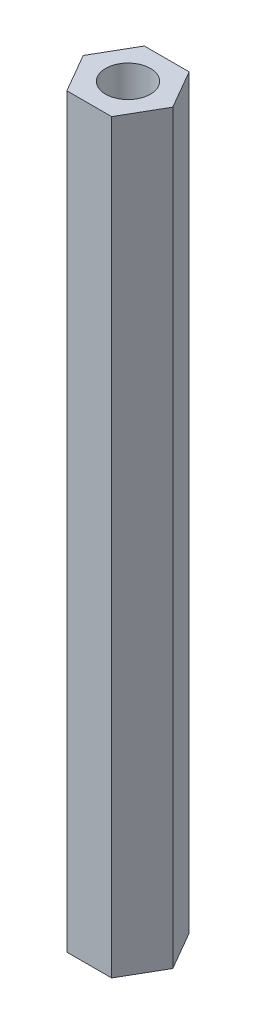
ISO-10303-21;
HEADER;
FILE_DESCRIPTION(('STEP AP214'),'2;1');
FILE_NAME('part.step','',(''),(''),'','','');
FILE_SCHEMA(('AUTOMOTIVE_DESIGN { 1 0 10303 214 1 1 1 1 }'));
ENDSEC;
DATA;
#1=APPLICATION_CONTEXT('core data for automotive mechanical design processes');
#2=APPLICATION_PROTOCOL_DEFINITION('international standard','automotive_design',2000,#1);
#3=PRODUCT_CONTEXT('',#1,'mechanical');
#4=PRODUCT('Part','Part','',(#3));
#5=PRODUCT_RELATED_PRODUCT_CATEGORY('part','',(#4));
#6=PRODUCT_DEFINITION_FORMATION('','',#4);
#7=PRODUCT_DEFINITION_CONTEXT('part definition',#1,'design');
#8=PRODUCT_DEFINITION('design','',#6,#7);
#9=PRODUCT_DEFINITION_SHAPE('','',#8);
#10=(LENGTH_UNIT() NAMED_UNIT(*) SI_UNIT(.MILLI.,.METRE.));
#11=(NAMED_UNIT(*) PLANE_ANGLE_UNIT() SI_UNIT($,.RADIAN.));
#12=(NAMED_UNIT(*) SI_UNIT($,.STERADIAN.) SOLID_ANGLE_UNIT());
#13=UNCERTAINTY_MEASURE_WITH_UNIT(LENGTH_MEASURE(1.E-05),#10,'distance_accuracy_value','');
#14=(GEOMETRIC_REPRESENTATION_CONTEXT(3) GLOBAL_UNCERTAINTY_ASSIGNED_CONTEXT((#13)) GLOBAL_UNIT_ASSIGNED_CONTEXT((#10,
#11,#12)) REPRESENTATION_CONTEXT('',''));
#15=CARTESIAN_POINT('',(0.,0.,0.));
#16=DIRECTION('',(0.,0.,1.));
#17=DIRECTION('',(1.,0.,0.));
#18=AXIS2_PLACEMENT_3D('',#15,#16,#17);
#19=CARTESIAN_POINT('',(0.,50.,0.));
#20=DIRECTION('',(0.,1.,0.));
#21=DIRECTION('',(0.,0.,1.));
#22=AXIS2_PLACEMENT_3D('',#19,#20,#21);
#23=PLANE('',#22);
#24=DIRECTION('',(0.5,0.,-0.866025403784439));
#25=VECTOR('',#24,1.);
#26=CARTESIAN_POINT('',(1.5,50.,2.59807621135332));
#27=LINE('',#26,#25);
#28=CARTESIAN_POINT('',(1.5,50.,2.59807621135332));
#29=VERTEX_POINT('',#28);
#30=CARTESIAN_POINT('',(3.,50.,0.));
#31=VERTEX_POINT('',#30);
#32=EDGE_CURVE('E133',#29,#31,#27,.T.);
#33=ORIENTED_EDGE('',*,*,#32,.T.);
#34=DIRECTION('',(-0.5,0.,-0.866025403784438));
#35=VECTOR('',#34,1.);
#36=CARTESIAN_POINT('',(3.,50.,0.));
#37=LINE('',#36,#35);
#38=CARTESIAN_POINT('',(1.5,50.,-2.59807621135332));
#39=VERTEX_POINT('',#38);
#40=EDGE_CURVE('E91',#31,#39,#37,.T.);
#41=ORIENTED_EDGE('',*,*,#40,.T.);
#42=DIRECTION('',(-1.,0.,0.));
#43=VECTOR('',#42,1.);
#44=CARTESIAN_POINT('',(1.5,50.,-2.59807621135332));
#45=LINE('',#44,#43);
#46=CARTESIAN_POINT('',(-1.5,50.,-2.59807621135332));
#47=VERTEX_POINT('',#46);
#48=EDGE_CURVE('E104',#39,#47,#45,.T.);
#49=ORIENTED_EDGE('',*,*,#48,.T.);
#50=DIRECTION('',(-0.5,0.,0.866025403784439));
#51=VECTOR('',#50,1.);
#52=CARTESIAN_POINT('',(-1.5,50.,-2.59807621135332));
#53=LINE('',#52,#51);
#54=CARTESIAN_POINT('',(-3.,50.,0.));
#55=VERTEX_POINT('',#54);
#56=EDGE_CURVE('E98',#47,#55,#53,.T.);
#57=ORIENTED_EDGE('',*,*,#56,.T.);
#58=DIRECTION('',(0.5,0.,0.866025403784439));
#59=VECTOR('',#58,1.);
#60=CARTESIAN_POINT('',(-3.,50.,0.));
#61=LINE('',#60,#59);
#62=CARTESIAN_POINT('',(-1.5,50.,2.59807621135332));
#63=VERTEX_POINT('',#62);
#64=EDGE_CURVE('E102',#55,#63,#61,.T.);
#65=ORIENTED_EDGE('',*,*,#64,.T.);
#66=DIRECTION('',(1.,0.,0.));
#67=VECTOR('',#66,1.);
#68=CARTESIAN_POINT('',(-1.5,50.,2.59807621135332));
#69=LINE('',#68,#67);
#70=EDGE_CURVE('E54',#63,#29,#69,.T.);
#71=ORIENTED_EDGE('',*,*,#70,.T.);
#72=EDGE_LOOP('',(#33,#41,#49,#57,#65,#71));
#73=FACE_BOUND('',#72,.T.);
#74=CARTESIAN_POINT('',(0.,50.,0.));
#75=DIRECTION('',(0.,1.,0.));
#76=DIRECTION('',(0.,0.,1.));
#77=AXIS2_PLACEMENT_3D('',#74,#75,#76);
#78=CIRCLE('',#77,1.5);
#79=CARTESIAN_POINT('',(0.,50.,1.5));
#80=VERTEX_POINT('',#79);
#81=EDGE_CURVE('E126',#80,#80,#78,.T.);
#82=ORIENTED_EDGE('',*,*,#81,.F.);
#83=EDGE_LOOP('',(#82));
#84=FACE_BOUND('',#83,.T.);
#85=ADVANCED_FACE('F37',(#73,#84),#23,.T.);
#86=CARTESIAN_POINT('',(0.,0.,0.));
#87=DIRECTION('',(0.,1.,0.));
#88=DIRECTION('',(0.,0.,1.));
#89=AXIS2_PLACEMENT_3D('',#86,#87,#88);
#90=PLANE('',#89);
#91=DIRECTION('',(0.5,0.,-0.866025403784439));
#92=VECTOR('',#91,1.);
#93=CARTESIAN_POINT('',(1.5,0.,2.59807621135332));
#94=LINE('',#93,#92);
#95=CARTESIAN_POINT('',(1.5,0.,2.59807621135332));
#96=VERTEX_POINT('',#95);
#97=CARTESIAN_POINT('',(3.,0.,0.));
#98=VERTEX_POINT('',#97);
#99=EDGE_CURVE('E122',#96,#98,#94,.T.);
#100=ORIENTED_EDGE('',*,*,#99,.F.);
#101=DIRECTION('',(1.,0.,0.));
#102=VECTOR('',#101,1.);
#103=CARTESIAN_POINT('',(-1.5,0.,2.59807621135332));
#104=LINE('',#103,#102);
#105=CARTESIAN_POINT('',(-1.5,0.,2.59807621135332));
#106=VERTEX_POINT('',#105);
#107=EDGE_CURVE('E83',#106,#96,#104,.T.);
#108=ORIENTED_EDGE('',*,*,#107,.F.);
#109=DIRECTION('',(0.5,0.,0.866025403784439));
#110=VECTOR('',#109,1.);
#111=CARTESIAN_POINT('',(-3.,0.,0.));
#112=LINE('',#111,#110);
#113=CARTESIAN_POINT('',(-3.,0.,0.));
#114=VERTEX_POINT('',#113);
#115=EDGE_CURVE('E77',#114,#106,#112,.T.);
#116=ORIENTED_EDGE('',*,*,#115,.F.);
#117=DIRECTION('',(-0.5,0.,0.866025403784439));
#118=VECTOR('',#117,1.);
#119=CARTESIAN_POINT('',(-1.5,0.,-2.59807621135332));
#120=LINE('',#119,#118);
#121=CARTESIAN_POINT('',(-1.5,0.,-2.59807621135332));
#122=VERTEX_POINT('',#121);
#123=EDGE_CURVE('E112',#122,#114,#120,.T.);
#124=ORIENTED_EDGE('',*,*,#123,.F.);
#125=DIRECTION('',(-1.,0.,0.));
#126=VECTOR('',#125,1.);
#127=CARTESIAN_POINT('',(1.5,0.,-2.59807621135332));
#128=LINE('',#127,#126);
#129=CARTESIAN_POINT('',(1.5,0.,-2.59807621135332));
#130=VERTEX_POINT('',#129);
#131=EDGE_CURVE('E128',#130,#122,#128,.T.);
#132=ORIENTED_EDGE('',*,*,#131,.F.);
#133=DIRECTION('',(-0.5,0.,-0.866025403784438));
#134=VECTOR('',#133,1.);
#135=CARTESIAN_POINT('',(3.,0.,0.));
#136=LINE('',#135,#134);
#137=EDGE_CURVE('E125',#98,#130,#136,.T.);
#138=ORIENTED_EDGE('',*,*,#137,.F.);
#139=EDGE_LOOP('',(#100,#108,#116,#124,#132,#138));
#140=FACE_BOUND('',#139,.T.);
#141=CARTESIAN_POINT('',(0.,0.,0.));
#142=DIRECTION('',(0.,1.,0.));
#143=DIRECTION('',(0.,0.,1.));
#144=AXIS2_PLACEMENT_3D('',#141,#142,#143);
#145=CIRCLE('',#144,1.5);
#146=CARTESIAN_POINT('',(0.,0.,1.5));
#147=VERTEX_POINT('',#146);
#148=EDGE_CURVE('E226',#147,#147,#145,.T.);
#149=ORIENTED_EDGE('',*,*,#148,.T.);
#150=EDGE_LOOP('',(#149));
#151=FACE_BOUND('',#150,.T.);
#152=ADVANCED_FACE('F142',(#140,#151),#90,.F.);
#153=CARTESIAN_POINT('',(1.5,50.,2.59807621135332));
#154=DIRECTION('',(-0.866025403784439,0.,-0.5));
#155=DIRECTION('',(-0.5,0.,0.866025403784439));
#156=AXIS2_PLACEMENT_3D('',#153,#154,#155);
#157=PLANE('',#156);
#158=ORIENTED_EDGE('',*,*,#99,.T.);
#159=DIRECTION('',(0.,-1.,0.));
#160=VECTOR('',#159,1.);
#161=CARTESIAN_POINT('',(3.,50.,0.));
#162=LINE('',#161,#160);
#163=EDGE_CURVE('E11',#31,#98,#162,.T.);
#164=ORIENTED_EDGE('',*,*,#163,.F.);
#165=ORIENTED_EDGE('',*,*,#32,.F.);
#166=DIRECTION('',(0.,-1.,0.));
#167=VECTOR('',#166,1.);
#168=CARTESIAN_POINT('',(1.5,50.,2.59807621135332));
#169=LINE('',#168,#167);
#170=EDGE_CURVE('E118',#29,#96,#169,.T.);
#171=ORIENTED_EDGE('',*,*,#170,.T.);
#172=EDGE_LOOP('',(#158,#164,#165,#171));
#173=FACE_BOUND('',#172,.T.);
#174=ADVANCED_FACE('F39',(#173),#157,.F.);
#175=CARTESIAN_POINT('',(3.,50.,0.));
#176=DIRECTION('',(-0.866025403784438,0.,0.5));
#177=DIRECTION('',(0.5,0.,0.866025403784438));
#178=AXIS2_PLACEMENT_3D('',#175,#176,#177);
#179=PLANE('',#178);
#180=ORIENTED_EDGE('',*,*,#137,.T.);
#181=DIRECTION('',(0.,-1.,0.));
#182=VECTOR('',#181,1.);
#183=CARTESIAN_POINT('',(1.5,50.,-2.59807621135332));
#184=LINE('',#183,#182);
#185=EDGE_CURVE('E46',#39,#130,#184,.T.);
#186=ORIENTED_EDGE('',*,*,#185,.F.);
#187=ORIENTED_EDGE('',*,*,#40,.F.);
#188=ORIENTED_EDGE('',*,*,#163,.T.);
#189=EDGE_LOOP('',(#180,#186,#187,#188));
#190=FACE_BOUND('',#189,.T.);
#191=ADVANCED_FACE('F167',(#190),#179,.F.);
#192=CARTESIAN_POINT('',(1.5,50.,-2.59807621135332));
#193=DIRECTION('',(0.,0.,1.));
#194=DIRECTION('',(1.,0.,0.));
#195=AXIS2_PLACEMENT_3D('',#192,#193,#194);
#196=PLANE('',#195);
#197=ORIENTED_EDGE('',*,*,#131,.T.);
#198=DIRECTION('',(0.,-1.,0.));
#199=VECTOR('',#198,1.);
#200=CARTESIAN_POINT('',(-1.5,50.,-2.59807621135332));
#201=LINE('',#200,#199);
#202=EDGE_CURVE('E113',#47,#122,#201,.T.);
#203=ORIENTED_EDGE('',*,*,#202,.F.);
#204=ORIENTED_EDGE('',*,*,#48,.F.);
#205=ORIENTED_EDGE('',*,*,#185,.T.);
#206=EDGE_LOOP('',(#197,#203,#204,#205));
#207=FACE_BOUND('',#206,.T.);
#208=ADVANCED_FACE('F139',(#207),#196,.F.);
#209=CARTESIAN_POINT('',(-1.5,50.,-2.59807621135332));
#210=DIRECTION('',(0.866025403784439,0.,0.5));
#211=DIRECTION('',(0.5,0.,-0.866025403784439));
#212=AXIS2_PLACEMENT_3D('',#209,#210,#211);
#213=PLANE('',#212);
#214=ORIENTED_EDGE('',*,*,#123,.T.);
#215=DIRECTION('',(0.,-1.,0.));
#216=VECTOR('',#215,1.);
#217=CARTESIAN_POINT('',(-3.,50.,0.));
#218=LINE('',#217,#216);
#219=EDGE_CURVE('E109',#55,#114,#218,.T.);
#220=ORIENTED_EDGE('',*,*,#219,.F.);
#221=ORIENTED_EDGE('',*,*,#56,.F.);
#222=ORIENTED_EDGE('',*,*,#202,.T.);
#223=EDGE_LOOP('',(#214,#220,#221,#222));
#224=FACE_BOUND('',#223,.T.);
#225=ADVANCED_FACE('F110',(#224),#213,.F.);
#226=CARTESIAN_POINT('',(-3.,50.,0.));
#227=DIRECTION('',(0.866025403784439,0.,-0.5));
#228=DIRECTION('',(-0.5,0.,-0.866025403784439));
#229=AXIS2_PLACEMENT_3D('',#226,#227,#228);
#230=PLANE('',#229);
#231=ORIENTED_EDGE('',*,*,#115,.T.);
#232=DIRECTION('',(0.,-1.,0.));
#233=VECTOR('',#232,1.);
#234=CARTESIAN_POINT('',(-1.5,50.,2.59807621135332));
#235=LINE('',#234,#233);
#236=EDGE_CURVE('E114',#63,#106,#235,.T.);
#237=ORIENTED_EDGE('',*,*,#236,.F.);
#238=ORIENTED_EDGE('',*,*,#64,.F.);
#239=ORIENTED_EDGE('',*,*,#219,.T.);
#240=EDGE_LOOP('',(#231,#237,#238,#239));
#241=FACE_BOUND('',#240,.T.);
#242=ADVANCED_FACE('F116',(#241),#230,.F.);
#243=CARTESIAN_POINT('',(-1.5,50.,2.59807621135332));
#244=DIRECTION('',(0.,0.,-1.));
#245=DIRECTION('',(-1.,0.,0.));
#246=AXIS2_PLACEMENT_3D('',#243,#244,#245);
#247=PLANE('',#246);
#248=ORIENTED_EDGE('',*,*,#107,.T.);
#249=ORIENTED_EDGE('',*,*,#170,.F.);
#250=ORIENTED_EDGE('',*,*,#70,.F.);
#251=ORIENTED_EDGE('',*,*,#236,.T.);
#252=EDGE_LOOP('',(#248,#249,#250,#251));
#253=FACE_BOUND('',#252,.T.);
#254=ADVANCED_FACE('F147',(#253),#247,.F.);
#255=CARTESIAN_POINT('',(0.,50.,0.));
#256=DIRECTION('',(0.,-1.,0.));
#257=DIRECTION('',(0.,0.,-1.));
#258=AXIS2_PLACEMENT_3D('',#255,#256,#257);
#259=CYLINDRICAL_SURFACE('',#258,1.5);
#260=ORIENTED_EDGE('',*,*,#81,.T.);
#261=EDGE_LOOP('',(#260));
#262=FACE_BOUND('',#261,.T.);
#263=ORIENTED_EDGE('',*,*,#148,.F.);
#264=EDGE_LOOP('',(#263));
#265=FACE_BOUND('',#264,.T.);
#266=ADVANCED_FACE('F149',(#262,#265),#259,.F.);
#267=CLOSED_SHELL('',(#85,#152,#174,#191,#208,#225,#242,#254,#266));
#268=MANIFOLD_SOLID_BREP('B2',#267);
#269=ADVANCED_BREP_SHAPE_REPRESENTATION('',(#18,#268),#14);
#270=SHAPE_DEFINITION_REPRESENTATION(#9,#269);
ENDSEC;
END-ISO-10303-21;
